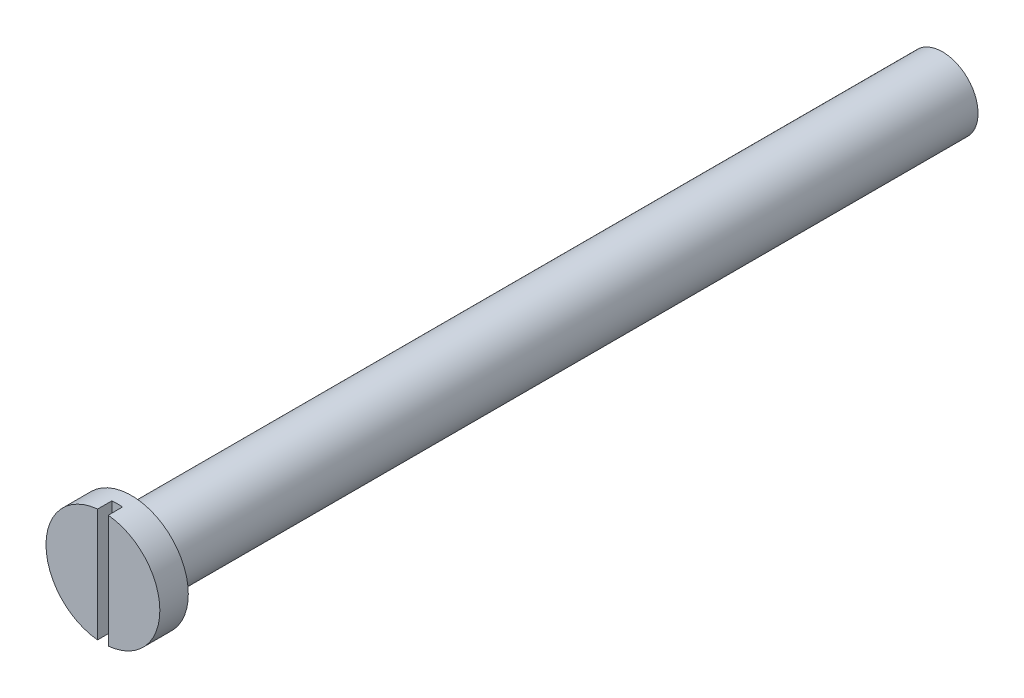
ISO-10303-21;
HEADER;
FILE_DESCRIPTION(('STEP AP214'),'2;1');
FILE_NAME('part.step','',(''),(''),'','','');
FILE_SCHEMA(('AUTOMOTIVE_DESIGN { 1 0 10303 214 1 1 1 1 }'));
ENDSEC;
DATA;
#1=APPLICATION_CONTEXT('core data for automotive mechanical design processes');
#2=APPLICATION_PROTOCOL_DEFINITION('international standard','automotive_design',2000,#1);
#3=PRODUCT_CONTEXT('',#1,'mechanical');
#4=PRODUCT('Part','Part','',(#3));
#5=PRODUCT_RELATED_PRODUCT_CATEGORY('part','',(#4));
#6=PRODUCT_DEFINITION_FORMATION('','',#4);
#7=PRODUCT_DEFINITION_CONTEXT('part definition',#1,'design');
#8=PRODUCT_DEFINITION('design','',#6,#7);
#9=PRODUCT_DEFINITION_SHAPE('','',#8);
#10=(LENGTH_UNIT() NAMED_UNIT(*) SI_UNIT(.MILLI.,.METRE.));
#11=(NAMED_UNIT(*) PLANE_ANGLE_UNIT() SI_UNIT($,.RADIAN.));
#12=(NAMED_UNIT(*) SI_UNIT($,.STERADIAN.) SOLID_ANGLE_UNIT());
#13=UNCERTAINTY_MEASURE_WITH_UNIT(LENGTH_MEASURE(1.E-05),#10,'distance_accuracy_value','');
#14=(GEOMETRIC_REPRESENTATION_CONTEXT(3) GLOBAL_UNCERTAINTY_ASSIGNED_CONTEXT((#13)) GLOBAL_UNIT_ASSIGNED_CONTEXT((#10,
#11,#12)) REPRESENTATION_CONTEXT('',''));
#15=CARTESIAN_POINT('',(0.,0.,0.));
#16=DIRECTION('',(0.,0.,1.));
#17=DIRECTION('',(1.,0.,0.));
#18=AXIS2_PLACEMENT_3D('',#15,#16,#17);
#19=CARTESIAN_POINT('',(0.,0.,118.));
#20=DIRECTION('',(0.,0.,1.));
#21=DIRECTION('',(1.,0.,0.));
#22=AXIS2_PLACEMENT_3D('',#19,#20,#21);
#23=PLANE('',#22);
#24=DIRECTION('',(0.,1.,0.));
#25=VECTOR('',#24,1.);
#26=CARTESIAN_POINT('',(0.75,0.,118.));
#27=LINE('',#26,#25);
#28=CARTESIAN_POINT('',(0.75,-7.96476616103699,118.));
#29=VERTEX_POINT('',#28);
#30=CARTESIAN_POINT('',(0.75,7.964766161037,118.));
#31=VERTEX_POINT('',#30);
#32=EDGE_CURVE('E124',#29,#31,#27,.T.);
#33=ORIENTED_EDGE('',*,*,#32,.F.);
#34=CARTESIAN_POINT('',(0.,0.,118.));
#35=DIRECTION('',(0.,0.,1.));
#36=DIRECTION('',(1.,0.,0.));
#37=AXIS2_PLACEMENT_3D('',#34,#35,#36);
#38=CIRCLE('',#37,8.);
#39=EDGE_CURVE('E111',#29,#31,#38,.T.);
#40=ORIENTED_EDGE('',*,*,#39,.T.);
#41=EDGE_LOOP('',(#33,#40));
#42=FACE_BOUND('',#41,.T.);
#43=ADVANCED_FACE('F39',(#42),#23,.T.);
#44=CARTESIAN_POINT('',(0.,0.,114.));
#45=DIRECTION('',(0.,0.,-1.));
#46=DIRECTION('',(-1.,0.,0.));
#47=AXIS2_PLACEMENT_3D('',#44,#45,#46);
#48=CYLINDRICAL_SURFACE('',#47,5.);
#49=CARTESIAN_POINT('',(0.,0.,114.));
#50=DIRECTION('',(0.,0.,1.));
#51=DIRECTION('',(1.,0.,0.));
#52=AXIS2_PLACEMENT_3D('',#49,#50,#51);
#53=CIRCLE('',#52,5.);
#54=CARTESIAN_POINT('',(-5.,0.,114.));
#55=VERTEX_POINT('',#54);
#56=EDGE_CURVE('E117',#55,#55,#53,.T.);
#57=CARTESIAN_POINT('',(0.,0.,0.));
#58=DIRECTION('',(0.,0.,1.));
#59=DIRECTION('',(1.,0.,0.));
#60=AXIS2_PLACEMENT_3D('',#57,#58,#59);
#61=CIRCLE('',#60,5.);
#62=CARTESIAN_POINT('',(-5.,0.,0.));
#63=VERTEX_POINT('',#62);
#64=EDGE_CURVE('E121',#63,#63,#61,.T.);
#65=CARTESIAN_POINT('',(-5.,0.,114.));
#66=CARTESIAN_POINT('',(-5.,0.,112.8125));
#67=CARTESIAN_POINT('',(-5.,0.,111.625));
#68=CARTESIAN_POINT('',(-5.,0.,109.25));
#69=CARTESIAN_POINT('',(-5.,0.,108.0625));
#70=CARTESIAN_POINT('',(-5.,0.,105.6875));
#71=CARTESIAN_POINT('',(-5.,0.,104.5));
#72=CARTESIAN_POINT('',(-5.,0.,102.125));
#73=CARTESIAN_POINT('',(-5.,0.,100.9375));
#74=CARTESIAN_POINT('',(-5.,0.,98.5625));
#75=CARTESIAN_POINT('',(-5.,0.,97.375));
#76=CARTESIAN_POINT('',(-5.,0.,95.));
#77=CARTESIAN_POINT('',(-5.,0.,93.8125));
#78=CARTESIAN_POINT('',(-5.,0.,91.4375));
#79=CARTESIAN_POINT('',(-5.,0.,90.25));
#80=CARTESIAN_POINT('',(-5.,0.,87.875));
#81=CARTESIAN_POINT('',(-5.,0.,86.6875));
#82=CARTESIAN_POINT('',(-5.,0.,84.3125));
#83=CARTESIAN_POINT('',(-5.,0.,83.125));
#84=CARTESIAN_POINT('',(-5.,0.,80.75));
#85=CARTESIAN_POINT('',(-5.,0.,79.5625));
#86=CARTESIAN_POINT('',(-5.,0.,77.1875));
#87=CARTESIAN_POINT('',(-5.,0.,76.));
#88=CARTESIAN_POINT('',(-5.,0.,73.625));
#89=CARTESIAN_POINT('',(-5.,0.,72.4375));
#90=CARTESIAN_POINT('',(-5.,0.,70.0625));
#91=CARTESIAN_POINT('',(-5.,0.,68.875));
#92=CARTESIAN_POINT('',(-5.,0.,66.5));
#93=CARTESIAN_POINT('',(-5.,0.,65.3125));
#94=CARTESIAN_POINT('',(-5.,0.,62.9375));
#95=CARTESIAN_POINT('',(-5.,0.,61.75));
#96=CARTESIAN_POINT('',(-5.,0.,59.375));
#97=CARTESIAN_POINT('',(-5.,0.,58.1875));
#98=CARTESIAN_POINT('',(-5.,0.,55.8125));
#99=CARTESIAN_POINT('',(-5.,0.,54.625));
#100=CARTESIAN_POINT('',(-5.,0.,52.25));
#101=CARTESIAN_POINT('',(-5.,0.,51.0625));
#102=CARTESIAN_POINT('',(-5.,0.,48.6875));
#103=CARTESIAN_POINT('',(-5.,0.,47.5));
#104=CARTESIAN_POINT('',(-5.,0.,45.125));
#105=CARTESIAN_POINT('',(-5.,0.,43.9375));
#106=CARTESIAN_POINT('',(-5.,0.,41.5625));
#107=CARTESIAN_POINT('',(-5.,0.,40.375));
#108=CARTESIAN_POINT('',(-5.,0.,38.));
#109=CARTESIAN_POINT('',(-5.,0.,36.8125));
#110=CARTESIAN_POINT('',(-5.,0.,34.4375));
#111=CARTESIAN_POINT('',(-5.,0.,33.25));
#112=CARTESIAN_POINT('',(-5.,0.,30.875));
#113=CARTESIAN_POINT('',(-5.,0.,29.6875));
#114=CARTESIAN_POINT('',(-5.,0.,27.3125));
#115=CARTESIAN_POINT('',(-5.,0.,26.125));
#116=CARTESIAN_POINT('',(-5.,0.,23.75));
#117=CARTESIAN_POINT('',(-5.,0.,22.5625));
#118=CARTESIAN_POINT('',(-5.,0.,20.1875));
#119=CARTESIAN_POINT('',(-5.,0.,19.));
#120=CARTESIAN_POINT('',(-5.,0.,16.625));
#121=CARTESIAN_POINT('',(-5.,0.,15.4375));
#122=CARTESIAN_POINT('',(-5.,0.,13.0625));
#123=CARTESIAN_POINT('',(-5.,0.,11.875));
#124=CARTESIAN_POINT('',(-5.,0.,9.5));
#125=CARTESIAN_POINT('',(-5.,0.,8.31250000000001));
#126=CARTESIAN_POINT('',(-5.,0.,5.9375));
#127=CARTESIAN_POINT('',(-5.,0.,4.75));
#128=CARTESIAN_POINT('',(-5.,0.,2.375));
#129=CARTESIAN_POINT('',(-5.,0.,1.1875));
#130=CARTESIAN_POINT('',(-5.,0.,0.));
#131=B_SPLINE_CURVE_WITH_KNOTS('',3,(#65,#66,#67,#68,#69,#70,#71,#72,#73,#74,#75,#76,#77,#78,
#79,#80,#81,#82,#83,#84,#85,#86,#87,#88,#89,#90,#91,#92,#93,#94,#95,#96,#97,#98,#99,#100,#101,
#102,#103,#104,#105,#106,#107,#108,#109,#110,#111,#112,#113,#114,#115,#116,#117,#118,#119,#120,
#121,#122,#123,#124,#125,#126,#127,#128,#129,#130),.UNSPECIFIED.,.F.,.F.,(4,2,2,2,2,2,2,2,2,2,2,
2,2,2,2,2,2,2,2,2,2,2,2,2,2,2,2,2,2,2,2,2,4),(0.,3.56250000000001,7.12500000000001,10.6875,
14.25,17.8125,21.375,24.9375,28.5,32.0625,35.625,39.1875,42.75,46.3125,49.875,53.4375,57.,
60.5625,64.125,67.6875,71.25,74.8125,78.375,81.9375,85.5,89.0625,92.625,96.1875,99.75,103.3125,
106.875,110.4375,114.),.UNSPECIFIED.);
#132=EDGE_CURVE('BSEAM41',#55,#63,#131,.T.);
#133=ORIENTED_EDGE('',*,*,#56,.F.);
#134=ORIENTED_EDGE('',*,*,#64,.T.);
#135=ORIENTED_EDGE('',*,*,#132,.T.);
#136=ORIENTED_EDGE('',*,*,#132,.F.);
#137=EDGE_LOOP('',(#133,#135,#134,#136));
#138=FACE_BOUND('',#137,.T.);
#139=ADVANCED_FACE('F41',(#138),#48,.T.);
#140=CARTESIAN_POINT('',(0.,0.,0.));
#141=DIRECTION('',(0.,0.,1.));
#142=DIRECTION('',(1.,0.,0.));
#143=AXIS2_PLACEMENT_3D('',#140,#141,#142);
#144=PLANE('',#143);
#145=CARTESIAN_POINT('',(0.,0.,0.));
#146=DIRECTION('',(0.,0.,-1.));
#147=DIRECTION('',(-1.,0.,0.));
#148=AXIS2_PLACEMENT_3D('',#145,#146,#147);
#149=CIRCLE('',#148,3.4);
#150=CARTESIAN_POINT('',(-3.4,0.,0.));
#151=VERTEX_POINT('',#150);
#152=EDGE_CURVE('E93',#151,#151,#149,.T.);
#153=ORIENTED_EDGE('',*,*,#152,.F.);
#154=EDGE_LOOP('',(#153));
#155=FACE_BOUND('',#154,.T.);
#156=ORIENTED_EDGE('',*,*,#64,.F.);
#157=EDGE_LOOP('',(#156));
#158=FACE_BOUND('',#157,.T.);
#159=ADVANCED_FACE('F142',(#155,#158),#144,.F.);
#160=CARTESIAN_POINT('',(0.,0.,118.));
#161=DIRECTION('',(0.,0.,-1.));
#162=DIRECTION('',(-1.,0.,0.));
#163=AXIS2_PLACEMENT_3D('',#160,#161,#162);
#164=CYLINDRICAL_SURFACE('',#163,8.);
#165=CARTESIAN_POINT('',(0.,0.,116.));
#166=DIRECTION('',(0.,0.,1.));
#167=DIRECTION('',(1.,0.,0.));
#168=AXIS2_PLACEMENT_3D('',#165,#166,#167);
#169=CIRCLE('',#168,8.);
#170=CARTESIAN_POINT('',(0.75,7.964766161037,116.));
#171=VERTEX_POINT('',#170);
#172=CARTESIAN_POINT('',(-0.75,7.96476616103699,116.));
#173=VERTEX_POINT('',#172);
#174=EDGE_CURVE('E11',#171,#173,#169,.T.);
#175=ORIENTED_EDGE('',*,*,#174,.F.);
#176=DIRECTION('',(0.,0.,-1.));
#177=VECTOR('',#176,1.);
#178=CARTESIAN_POINT('',(0.75,7.964766161037,118.));
#179=LINE('',#178,#177);
#180=EDGE_CURVE('E62',#171,#31,#179,.F.);
#181=ORIENTED_EDGE('',*,*,#180,.T.);
#182=ORIENTED_EDGE('',*,*,#39,.F.);
#183=DIRECTION('',(0.,0.,-1.));
#184=VECTOR('',#183,1.);
#185=CARTESIAN_POINT('',(0.75,-7.964766161037,118.));
#186=LINE('',#185,#184);
#187=CARTESIAN_POINT('',(0.75,-7.964766161037,116.));
#188=VERTEX_POINT('',#187);
#189=EDGE_CURVE('E107',#29,#188,#186,.T.);
#190=ORIENTED_EDGE('',*,*,#189,.T.);
#191=CARTESIAN_POINT('',(-0.75,-7.96476616103699,116.));
#192=VERTEX_POINT('',#191);
#193=EDGE_CURVE('E43',#192,#188,#169,.T.);
#194=ORIENTED_EDGE('',*,*,#193,.F.);
#195=DIRECTION('',(0.,0.,-1.));
#196=VECTOR('',#195,1.);
#197=CARTESIAN_POINT('',(-0.75,-7.96476616103699,118.));
#198=LINE('',#197,#196);
#199=CARTESIAN_POINT('',(-0.75,-7.96476616103699,118.));
#200=VERTEX_POINT('',#199);
#201=EDGE_CURVE('E102',#192,#200,#198,.F.);
#202=ORIENTED_EDGE('',*,*,#201,.T.);
#203=CARTESIAN_POINT('',(-0.75,7.96476616103699,118.));
#204=VERTEX_POINT('',#203);
#205=EDGE_CURVE('E114',#204,#200,#38,.T.);
#206=ORIENTED_EDGE('',*,*,#205,.F.);
#207=DIRECTION('',(0.,0.,-1.));
#208=VECTOR('',#207,1.);
#209=CARTESIAN_POINT('',(-0.75,7.96476616103699,118.));
#210=LINE('',#209,#208);
#211=EDGE_CURVE('E54',#204,#173,#210,.T.);
#212=ORIENTED_EDGE('',*,*,#211,.T.);
#213=EDGE_LOOP('',(#175,#181,#182,#190,#194,#202,#206,#212));
#214=FACE_BOUND('',#213,.T.);
#215=CARTESIAN_POINT('',(0.,0.,114.));
#216=DIRECTION('',(0.,0.,1.));
#217=DIRECTION('',(1.,0.,0.));
#218=AXIS2_PLACEMENT_3D('',#215,#216,#217);
#219=CIRCLE('',#218,8.);
#220=CARTESIAN_POINT('',(8.,0.,114.));
#221=VERTEX_POINT('',#220);
#222=EDGE_CURVE('E110',#221,#221,#219,.T.);
#223=ORIENTED_EDGE('',*,*,#222,.T.);
#224=EDGE_LOOP('',(#223));
#225=FACE_BOUND('',#224,.T.);
#226=ADVANCED_FACE('F133',(#214,#225),#164,.T.);
#227=DIRECTION('',(0.,-1.,0.));
#228=VECTOR('',#227,1.);
#229=CARTESIAN_POINT('',(-0.75,0.,118.));
#230=LINE('',#229,#228);
#231=EDGE_CURVE('E120',#204,#200,#230,.T.);
#232=ORIENTED_EDGE('',*,*,#231,.F.);
#233=ORIENTED_EDGE('',*,*,#205,.T.);
#234=EDGE_LOOP('',(#232,#233));
#235=FACE_BOUND('',#234,.T.);
#236=ADVANCED_FACE('F138',(#235),#23,.T.);
#237=CARTESIAN_POINT('',(0.,0.,114.));
#238=DIRECTION('',(0.,0.,1.));
#239=DIRECTION('',(1.,0.,0.));
#240=AXIS2_PLACEMENT_3D('',#237,#238,#239);
#241=PLANE('',#240);
#242=ORIENTED_EDGE('',*,*,#56,.T.);
#243=EDGE_LOOP('',(#242));
#244=FACE_BOUND('',#243,.T.);
#245=ORIENTED_EDGE('',*,*,#222,.F.);
#246=EDGE_LOOP('',(#245));
#247=FACE_BOUND('',#246,.T.);
#248=ADVANCED_FACE('F147',(#244,#247),#241,.F.);
#249=CARTESIAN_POINT('',(0.,0.,116.));
#250=DIRECTION('',(0.,0.,1.));
#251=DIRECTION('',(1.,0.,0.));
#252=AXIS2_PLACEMENT_3D('',#249,#250,#251);
#253=PLANE('',#252);
#254=ORIENTED_EDGE('',*,*,#174,.T.);
#255=DIRECTION('',(0.,-1.,0.));
#256=VECTOR('',#255,1.);
#257=CARTESIAN_POINT('',(-0.75,9.78002511975092,116.));
#258=LINE('',#257,#256);
#259=EDGE_CURVE('E95',#173,#192,#258,.T.);
#260=ORIENTED_EDGE('',*,*,#259,.T.);
#261=ORIENTED_EDGE('',*,*,#193,.T.);
#262=DIRECTION('',(0.,1.,0.));
#263=VECTOR('',#262,1.);
#264=CARTESIAN_POINT('',(0.75,9.78002511975092,116.));
#265=LINE('',#264,#263);
#266=EDGE_CURVE('E92',#188,#171,#265,.T.);
#267=ORIENTED_EDGE('',*,*,#266,.T.);
#268=EDGE_LOOP('',(#254,#260,#261,#267));
#269=FACE_BOUND('',#268,.T.);
#270=ADVANCED_FACE('F128',(#269),#253,.T.);
#271=CARTESIAN_POINT('',(0.75,9.78002511975092,116.));
#272=DIRECTION('',(1.,0.,0.));
#273=DIRECTION('',(0.,0.,-1.));
#274=AXIS2_PLACEMENT_3D('',#271,#272,#273);
#275=PLANE('',#274);
#276=ORIENTED_EDGE('',*,*,#32,.T.);
#277=ORIENTED_EDGE('',*,*,#180,.F.);
#278=ORIENTED_EDGE('',*,*,#266,.F.);
#279=ORIENTED_EDGE('',*,*,#189,.F.);
#280=EDGE_LOOP('',(#276,#277,#278,#279));
#281=FACE_BOUND('',#280,.T.);
#282=ADVANCED_FACE('F131',(#281),#275,.F.);
#283=CARTESIAN_POINT('',(-0.75,9.78002511975092,116.));
#284=DIRECTION('',(-1.,0.,0.));
#285=DIRECTION('',(0.,0.,1.));
#286=AXIS2_PLACEMENT_3D('',#283,#284,#285);
#287=PLANE('',#286);
#288=ORIENTED_EDGE('',*,*,#231,.T.);
#289=ORIENTED_EDGE('',*,*,#201,.F.);
#290=ORIENTED_EDGE('',*,*,#259,.F.);
#291=ORIENTED_EDGE('',*,*,#211,.F.);
#292=EDGE_LOOP('',(#288,#289,#290,#291));
#293=FACE_BOUND('',#292,.T.);
#294=ADVANCED_FACE('F86',(#293),#287,.F.);
#295=CARTESIAN_POINT('',(0.,0.,15.));
#296=DIRECTION('',(0.,0.,-1.));
#297=DIRECTION('',(-1.,0.,0.));
#298=AXIS2_PLACEMENT_3D('',#295,#296,#297);
#299=CONICAL_SURFACE('',#298,3.39999999999998,1.02974425867665);
#300=CARTESIAN_POINT('',(0.,0.,17.0429261046937));
#301=VERTEX_POINT('',#300);
#302=VERTEX_LOOP('',#301);
#303=FACE_BOUND('',#302,.T.);
#304=CARTESIAN_POINT('',(0.,0.,15.));
#305=DIRECTION('',(0.,0.,-1.));
#306=DIRECTION('',(-1.,0.,0.));
#307=AXIS2_PLACEMENT_3D('',#304,#305,#306);
#308=CIRCLE('',#307,3.39999999999998);
#309=CARTESIAN_POINT('',(-3.39999999999998,0.,15.));
#310=VERTEX_POINT('',#309);
#311=EDGE_CURVE('E90',#310,#310,#308,.T.);
#312=ORIENTED_EDGE('',*,*,#311,.T.);
#313=EDGE_LOOP('',(#312));
#314=FACE_BOUND('',#313,.T.);
#315=ADVANCED_FACE('F82',(#303,#314),#299,.F.);
#316=CARTESIAN_POINT('',(0.,0.,0.));
#317=DIRECTION('',(0.,0.,-1.));
#318=DIRECTION('',(-1.,0.,0.));
#319=AXIS2_PLACEMENT_3D('',#316,#317,#318);
#320=CYLINDRICAL_SURFACE('',#319,3.39999999999999);
#321=ORIENTED_EDGE('',*,*,#311,.F.);
#322=EDGE_LOOP('',(#321));
#323=FACE_BOUND('',#322,.T.);
#324=ORIENTED_EDGE('',*,*,#152,.T.);
#325=EDGE_LOOP('',(#324));
#326=FACE_BOUND('',#325,.T.);
#327=ADVANCED_FACE('F85',(#323,#326),#320,.F.);
#328=CLOSED_SHELL('',(#43,#139,#159,#226,#236,#248,#270,#282,#294,#315,#327));
#329=MANIFOLD_SOLID_BREP('B2',#328);
#330=ADVANCED_BREP_SHAPE_REPRESENTATION('',(#18,#329),#14);
#331=SHAPE_DEFINITION_REPRESENTATION(#9,#330);
ENDSEC;
END-ISO-10303-21;
